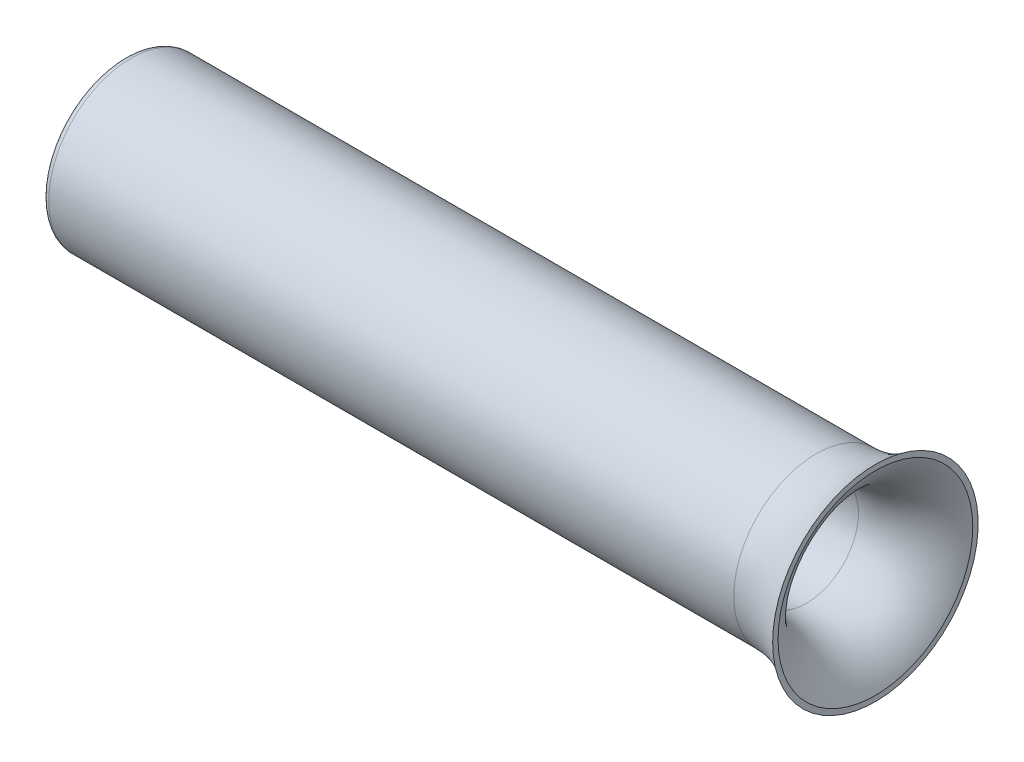
ISO-10303-21;
HEADER;
FILE_DESCRIPTION(('STEP AP214'),'2;1');
FILE_NAME('part.step','',(''),(''),'','','');
FILE_SCHEMA(('AUTOMOTIVE_DESIGN { 1 0 10303 214 1 1 1 1 }'));
ENDSEC;
DATA;
#1=APPLICATION_CONTEXT('core data for automotive mechanical design processes');
#2=APPLICATION_PROTOCOL_DEFINITION('international standard','automotive_design',2000,#1);
#3=PRODUCT_CONTEXT('',#1,'mechanical');
#4=PRODUCT('Part','Part','',(#3));
#5=PRODUCT_RELATED_PRODUCT_CATEGORY('part','',(#4));
#6=PRODUCT_DEFINITION_FORMATION('','',#4);
#7=PRODUCT_DEFINITION_CONTEXT('part definition',#1,'design');
#8=PRODUCT_DEFINITION('design','',#6,#7);
#9=PRODUCT_DEFINITION_SHAPE('','',#8);
#10=(LENGTH_UNIT() NAMED_UNIT(*) SI_UNIT(.MILLI.,.METRE.));
#11=(NAMED_UNIT(*) PLANE_ANGLE_UNIT() SI_UNIT($,.RADIAN.));
#12=(NAMED_UNIT(*) SI_UNIT($,.STERADIAN.) SOLID_ANGLE_UNIT());
#13=UNCERTAINTY_MEASURE_WITH_UNIT(LENGTH_MEASURE(1.E-05),#10,'distance_accuracy_value','');
#14=(GEOMETRIC_REPRESENTATION_CONTEXT(3) GLOBAL_UNCERTAINTY_ASSIGNED_CONTEXT((#13)) GLOBAL_UNIT_ASSIGNED_CONTEXT((#10,
#11,#12)) REPRESENTATION_CONTEXT('',''));
#15=CARTESIAN_POINT('',(0.,0.,0.));
#16=DIRECTION('',(0.,0.,1.));
#17=DIRECTION('',(1.,0.,0.));
#18=AXIS2_PLACEMENT_3D('',#15,#16,#17);
#19=CARTESIAN_POINT('',(51.7647994441541,0.,0.));
#20=DIRECTION('',(-1.,0.,0.));
#21=DIRECTION('',(0.,0.,1.));
#22=AXIS2_PLACEMENT_3D('',#19,#20,#21);
#23=TOROIDAL_SURFACE('',#22,9.65258023741334,5.70258023741334);
#24=CARTESIAN_POINT('',(51.7647994441541,0.,0.));
#25=DIRECTION('',(-1.,0.,0.));
#26=DIRECTION('',(0.,0.,1.));
#27=AXIS2_PLACEMENT_3D('',#24,#25,#26);
#28=CIRCLE('',#27,3.95);
#29=CARTESIAN_POINT('',(51.7647994441541,0.,3.95));
#30=VERTEX_POINT('',#29);
#31=EDGE_CURVE('E62',#30,#30,#28,.T.);
#32=ORIENTED_EDGE('',*,*,#31,.T.);
#33=EDGE_LOOP('',(#32));
#34=FACE_BOUND('',#33,.T.);
#35=CARTESIAN_POINT('',(57.,0.,0.));
#36=DIRECTION('',(-1.,0.,0.));
#37=DIRECTION('',(0.,0.,1.));
#38=AXIS2_PLACEMENT_3D('',#35,#36,#37);
#39=CIRCLE('',#38,7.39158565444597);
#40=CARTESIAN_POINT('',(57.,0.,7.39158565444597));
#41=VERTEX_POINT('',#40);
#42=EDGE_CURVE('E53',#41,#41,#39,.T.);
#43=ORIENTED_EDGE('',*,*,#42,.F.);
#44=EDGE_LOOP('',(#43));
#45=FACE_BOUND('',#44,.T.);
#46=ADVANCED_FACE('F33',(#34,#45),#23,.T.);
#47=CARTESIAN_POINT('',(57.,0.,0.));
#48=DIRECTION('',(-1.,0.,0.));
#49=DIRECTION('',(0.,0.,1.));
#50=AXIS2_PLACEMENT_3D('',#47,#48,#49);
#51=PLANE('',#50);
#52=CARTESIAN_POINT('',(57.,0.,0.));
#53=DIRECTION('',(-1.,0.,0.));
#54=DIRECTION('',(0.,0.,1.));
#55=AXIS2_PLACEMENT_3D('',#52,#53,#54);
#56=CIRCLE('',#55,7.8);
#57=CARTESIAN_POINT('',(57.,0.,7.8));
#58=VERTEX_POINT('',#57);
#59=EDGE_CURVE('E56',#58,#58,#56,.T.);
#60=ORIENTED_EDGE('',*,*,#59,.F.);
#61=EDGE_LOOP('',(#60));
#62=FACE_BOUND('',#61,.T.);
#63=ORIENTED_EDGE('',*,*,#42,.T.);
#64=EDGE_LOOP('',(#63));
#65=FACE_BOUND('',#64,.T.);
#66=ADVANCED_FACE('F82',(#62,#65),#51,.F.);
#67=CARTESIAN_POINT('',(52.5,0.,0.));
#68=DIRECTION('',(-1.,0.,0.));
#69=DIRECTION('',(0.,0.,1.));
#70=AXIS2_PLACEMENT_3D('',#67,#68,#69);
#71=TOROIDAL_SURFACE('',#70,13.5572580645161,7.30725806451613);
#72=CARTESIAN_POINT('',(52.5,0.,0.));
#73=DIRECTION('',(-1.,0.,0.));
#74=DIRECTION('',(0.,0.,1.));
#75=AXIS2_PLACEMENT_3D('',#72,#73,#74);
#76=CIRCLE('',#75,6.25);
#77=CARTESIAN_POINT('',(52.5,0.,6.25));
#78=VERTEX_POINT('',#77);
#79=EDGE_CURVE('E59',#78,#78,#76,.T.);
#80=ORIENTED_EDGE('',*,*,#79,.F.);
#81=EDGE_LOOP('',(#80));
#82=FACE_BOUND('',#81,.T.);
#83=ORIENTED_EDGE('',*,*,#59,.T.);
#84=EDGE_LOOP('',(#83));
#85=FACE_BOUND('',#84,.T.);
#86=ADVANCED_FACE('F87',(#82,#85),#71,.F.);
#87=CARTESIAN_POINT('',(0.,0.,0.));
#88=DIRECTION('',(-1.,0.,0.));
#89=DIRECTION('',(0.,0.,1.));
#90=AXIS2_PLACEMENT_3D('',#87,#88,#89);
#91=CYLINDRICAL_SURFACE('',#90,6.25);
#92=CARTESIAN_POINT('',(0.5,0.,0.));
#93=DIRECTION('',(-1.,0.,0.));
#94=DIRECTION('',(0.,0.,1.));
#95=AXIS2_PLACEMENT_3D('',#92,#93,#94);
#96=CIRCLE('',#95,6.25);
#97=CARTESIAN_POINT('',(0.5,0.,6.25));
#98=VERTEX_POINT('',#97);
#99=EDGE_CURVE('E10',#98,#98,#96,.F.);
#100=ORIENTED_EDGE('',*,*,#99,.T.);
#101=EDGE_LOOP('',(#100));
#102=FACE_BOUND('',#101,.T.);
#103=ORIENTED_EDGE('',*,*,#79,.T.);
#104=EDGE_LOOP('',(#103));
#105=FACE_BOUND('',#104,.T.);
#106=ADVANCED_FACE('F79',(#102,#105),#91,.T.);
#107=CARTESIAN_POINT('',(0.,0.,0.));
#108=DIRECTION('',(-1.,0.,0.));
#109=DIRECTION('',(0.,0.,1.));
#110=AXIS2_PLACEMENT_3D('',#107,#108,#109);
#111=PLANE('',#110);
#112=CARTESIAN_POINT('',(0.,0.,0.));
#113=DIRECTION('',(-1.,0.,0.));
#114=DIRECTION('',(0.,0.,1.));
#115=AXIS2_PLACEMENT_3D('',#112,#113,#114);
#116=CIRCLE('',#115,4.45);
#117=CARTESIAN_POINT('',(0.,0.,4.45));
#118=VERTEX_POINT('',#117);
#119=EDGE_CURVE('E40',#118,#118,#116,.F.);
#120=ORIENTED_EDGE('',*,*,#119,.T.);
#121=EDGE_LOOP('',(#120));
#122=FACE_BOUND('',#121,.T.);
#123=CARTESIAN_POINT('',(0.,0.,0.));
#124=DIRECTION('',(-1.,0.,0.));
#125=DIRECTION('',(0.,0.,1.));
#126=AXIS2_PLACEMENT_3D('',#123,#124,#125);
#127=CIRCLE('',#126,5.75);
#128=CARTESIAN_POINT('',(0.,0.,5.75));
#129=VERTEX_POINT('',#128);
#130=EDGE_CURVE('E44',#129,#129,#127,.T.);
#131=ORIENTED_EDGE('',*,*,#130,.T.);
#132=EDGE_LOOP('',(#131));
#133=FACE_BOUND('',#132,.T.);
#134=ADVANCED_FACE('F71',(#122,#133),#111,.T.);
#135=CARTESIAN_POINT('',(0.,0.,0.));
#136=DIRECTION('',(-1.,0.,0.));
#137=DIRECTION('',(0.,0.,1.));
#138=AXIS2_PLACEMENT_3D('',#135,#136,#137);
#139=CYLINDRICAL_SURFACE('',#138,3.95);
#140=CARTESIAN_POINT('',(0.5,0.,0.));
#141=DIRECTION('',(-1.,0.,0.));
#142=DIRECTION('',(0.,0.,1.));
#143=AXIS2_PLACEMENT_3D('',#140,#141,#142);
#144=CIRCLE('',#143,3.95);
#145=CARTESIAN_POINT('',(0.5,0.,3.95));
#146=VERTEX_POINT('',#145);
#147=EDGE_CURVE('E48',#146,#146,#144,.T.);
#148=ORIENTED_EDGE('',*,*,#147,.T.);
#149=EDGE_LOOP('',(#148));
#150=FACE_BOUND('',#149,.T.);
#151=ORIENTED_EDGE('',*,*,#31,.F.);
#152=EDGE_LOOP('',(#151));
#153=FACE_BOUND('',#152,.T.);
#154=ADVANCED_FACE('F68',(#150,#153),#139,.F.);
#155=CARTESIAN_POINT('',(0.5,0.,0.));
#156=DIRECTION('',(-1.,0.,0.));
#157=DIRECTION('',(0.,0.,1.));
#158=AXIS2_PLACEMENT_3D('',#155,#156,#157);
#159=TOROIDAL_SURFACE('',#158,4.45,0.5);
#160=ORIENTED_EDGE('',*,*,#119,.F.);
#161=EDGE_LOOP('',(#160));
#162=FACE_BOUND('',#161,.T.);
#163=ORIENTED_EDGE('',*,*,#147,.F.);
#164=EDGE_LOOP('',(#163));
#165=FACE_BOUND('',#164,.T.);
#166=ADVANCED_FACE('F70',(#162,#165),#159,.T.);
#167=CARTESIAN_POINT('',(0.5,0.,0.));
#168=DIRECTION('',(-1.,0.,0.));
#169=DIRECTION('',(0.,0.,1.));
#170=AXIS2_PLACEMENT_3D('',#167,#168,#169);
#171=TOROIDAL_SURFACE('',#170,5.75,0.5);
#172=ORIENTED_EDGE('',*,*,#99,.F.);
#173=EDGE_LOOP('',(#172));
#174=FACE_BOUND('',#173,.T.);
#175=ORIENTED_EDGE('',*,*,#130,.F.);
#176=EDGE_LOOP('',(#175));
#177=FACE_BOUND('',#176,.T.);
#178=ADVANCED_FACE('F35',(#174,#177),#171,.T.);
#179=CLOSED_SHELL('',(#46,#66,#86,#106,#134,#154,#166,#178));
#180=MANIFOLD_SOLID_BREP('B2',#179);
#181=ADVANCED_BREP_SHAPE_REPRESENTATION('',(#18,#180),#14);
#182=SHAPE_DEFINITION_REPRESENTATION(#9,#181);
ENDSEC;
END-ISO-10303-21;
